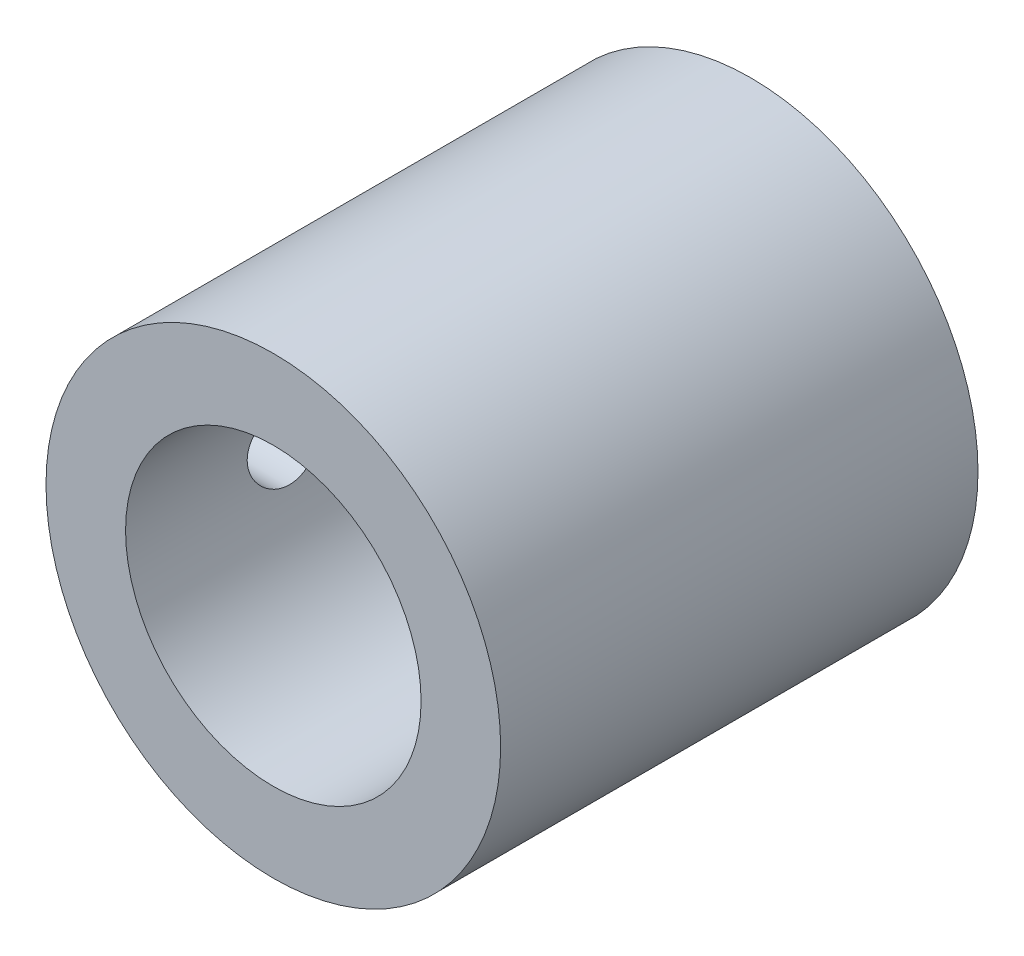
ISO-10303-21;
HEADER;
FILE_DESCRIPTION(('STEP AP214'),'2;1');
FILE_NAME('part.step','',(''),(''),'','','');
FILE_SCHEMA(('AUTOMOTIVE_DESIGN { 1 0 10303 214 1 1 1 1 }'));
ENDSEC;
DATA;
#1=APPLICATION_CONTEXT('core data for automotive mechanical design processes');
#2=APPLICATION_PROTOCOL_DEFINITION('international standard','automotive_design',2000,#1);
#3=PRODUCT_CONTEXT('',#1,'mechanical');
#4=PRODUCT('Part','Part','',(#3));
#5=PRODUCT_RELATED_PRODUCT_CATEGORY('part','',(#4));
#6=PRODUCT_DEFINITION_FORMATION('','',#4);
#7=PRODUCT_DEFINITION_CONTEXT('part definition',#1,'design');
#8=PRODUCT_DEFINITION('design','',#6,#7);
#9=PRODUCT_DEFINITION_SHAPE('','',#8);
#10=(LENGTH_UNIT() NAMED_UNIT(*) SI_UNIT(.MILLI.,.METRE.));
#11=(NAMED_UNIT(*) PLANE_ANGLE_UNIT() SI_UNIT($,.RADIAN.));
#12=(NAMED_UNIT(*) SI_UNIT($,.STERADIAN.) SOLID_ANGLE_UNIT());
#13=UNCERTAINTY_MEASURE_WITH_UNIT(LENGTH_MEASURE(1.E-05),#10,'distance_accuracy_value','');
#14=(GEOMETRIC_REPRESENTATION_CONTEXT(3) GLOBAL_UNCERTAINTY_ASSIGNED_CONTEXT((#13)) GLOBAL_UNIT_ASSIGNED_CONTEXT((#10,
#11,#12)) REPRESENTATION_CONTEXT('',''));
#15=CARTESIAN_POINT('',(0.,0.,0.));
#16=DIRECTION('',(0.,0.,1.));
#17=DIRECTION('',(1.,0.,0.));
#18=AXIS2_PLACEMENT_3D('',#15,#16,#17);
#19=CARTESIAN_POINT('',(0.,0.,0.));
#20=DIRECTION('',(0.,0.,1.));
#21=DIRECTION('',(1.,0.,0.));
#22=AXIS2_PLACEMENT_3D('',#19,#20,#21);
#23=PLANE('',#22);
#24=CARTESIAN_POINT('',(4.24264068711931,4.24264068711926,0.));
#25=DIRECTION('',(0.,0.,-1.));
#26=DIRECTION('',(-1.,0.,0.));
#27=AXIS2_PLACEMENT_3D('',#24,#25,#26);
#28=CIRCLE('',#27,1.24999999999999);
#29=CARTESIAN_POINT('',(2.99264068711932,4.24264068711926,0.));
#30=VERTEX_POINT('',#29);
#31=EDGE_CURVE('E85',#30,#30,#28,.T.);
#32=ORIENTED_EDGE('',*,*,#31,.F.);
#33=EDGE_LOOP('',(#32));
#34=FACE_BOUND('',#33,.T.);
#35=CARTESIAN_POINT('',(0.,0.,0.));
#36=DIRECTION('',(0.,0.,1.));
#37=DIRECTION('',(1.,0.,0.));
#38=AXIS2_PLACEMENT_3D('',#35,#36,#37);
#39=CIRCLE('',#38,10.);
#40=CARTESIAN_POINT('',(10.,0.,0.));
#41=VERTEX_POINT('',#40);
#42=EDGE_CURVE('E104',#41,#41,#39,.T.);
#43=ORIENTED_EDGE('',*,*,#42,.F.);
#44=EDGE_LOOP('',(#43));
#45=FACE_BOUND('',#44,.T.);
#46=CARTESIAN_POINT('',(4.24264068711931,-4.24264068711926,0.));
#47=DIRECTION('',(0.,0.,-1.));
#48=DIRECTION('',(-1.,0.,0.));
#49=AXIS2_PLACEMENT_3D('',#46,#47,#48);
#50=CIRCLE('',#49,1.24999999999999);
#51=CARTESIAN_POINT('',(2.99264068711932,-4.24264068711926,0.));
#52=VERTEX_POINT('',#51);
#53=EDGE_CURVE('E182',#52,#52,#50,.T.);
#54=ORIENTED_EDGE('',*,*,#53,.F.);
#55=EDGE_LOOP('',(#54));
#56=FACE_BOUND('',#55,.T.);
#57=CARTESIAN_POINT('',(-4.24264068711931,-4.24264068711926,0.));
#58=DIRECTION('',(0.,0.,-1.));
#59=DIRECTION('',(-1.,0.,0.));
#60=AXIS2_PLACEMENT_3D('',#57,#58,#59);
#61=CIRCLE('',#60,1.24999999999999);
#62=CARTESIAN_POINT('',(-5.4926406871193,-4.24264068711926,0.));
#63=VERTEX_POINT('',#62);
#64=EDGE_CURVE('E130',#63,#63,#61,.T.);
#65=ORIENTED_EDGE('',*,*,#64,.F.);
#66=EDGE_LOOP('',(#65));
#67=FACE_BOUND('',#66,.T.);
#68=CARTESIAN_POINT('',(-4.24264068711928,4.24264068711929,0.));
#69=DIRECTION('',(0.,0.,-1.));
#70=DIRECTION('',(-1.,0.,0.));
#71=AXIS2_PLACEMENT_3D('',#68,#69,#70);
#72=CIRCLE('',#71,1.24999999999999);
#73=CARTESIAN_POINT('',(-5.49264068711926,4.24264068711929,0.));
#74=VERTEX_POINT('',#73);
#75=EDGE_CURVE('E122',#74,#74,#72,.T.);
#76=ORIENTED_EDGE('',*,*,#75,.F.);
#77=EDGE_LOOP('',(#76));
#78=FACE_BOUND('',#77,.T.);
#79=ADVANCED_FACE('F37',(#34,#45,#56,#67,#78),#23,.F.);
#80=CARTESIAN_POINT('',(0.,0.,21.));
#81=DIRECTION('',(0.,0.,-1.));
#82=DIRECTION('',(-1.,0.,0.));
#83=AXIS2_PLACEMENT_3D('',#80,#81,#82);
#84=CYLINDRICAL_SURFACE('',#83,10.);
#85=CARTESIAN_POINT('',(-10.,0.,15.65));
#86=CARTESIAN_POINT('',(-9.99999843258099,-0.0920114531057511,15.6499962990147));
#87=CARTESIAN_POINT('',(-9.99871684765511,-0.184073454347172,15.6422775413146));
#88=CARTESIAN_POINT('',(-9.99372775496381,-0.365616322535329,15.6116187648621));
#89=CARTESIAN_POINT('',(-9.99001800272159,-0.455094721351768,15.5886646630412));
#90=CARTESIAN_POINT('',(-9.98058875631552,-0.628817487751614,15.5282463610641));
#91=CARTESIAN_POINT('',(-9.974870893487,-0.713066038744484,15.4907939364397));
#92=CARTESIAN_POINT('',(-9.96205444853338,-0.87407223650404,15.4024727458514));
#93=CARTESIAN_POINT('',(-9.95495602786423,-0.950830757653326,15.351605548495));
#94=CARTESIAN_POINT('',(-9.9400912001718,-1.09540879372213,15.2373912228671));
#95=CARTESIAN_POINT('',(-9.93231968689365,-1.16314787882339,15.1739429363817));
#96=CARTESIAN_POINT('',(-9.9170237472334,-1.28706950777735,15.0365852264068));
#97=CARTESIAN_POINT('',(-9.90949933632427,-1.34325132909588,14.9626751493568));
#98=CARTESIAN_POINT('',(-9.89550007731641,-1.44278500045253,14.8059406563233));
#99=CARTESIAN_POINT('',(-9.88903182722124,-1.48605749570898,14.7230652056561));
#100=CARTESIAN_POINT('',(-9.87794796970923,-1.55803674048924,14.5510973747635));
#101=CARTESIAN_POINT('',(-9.8733322397089,-1.58674445381556,14.4620054063507));
#102=CARTESIAN_POINT('',(-9.86652679242373,-1.6285261950301,14.280985417999));
#103=CARTESIAN_POINT('',(-9.86431555933323,-1.64173895927951,14.1890902443212));
#104=CARTESIAN_POINT('',(-9.86250435770823,-1.65258585530687,14.0043626340766));
#105=CARTESIAN_POINT('',(-9.86290420804218,-1.65022106770359,13.9115302629694));
#106=CARTESIAN_POINT('',(-9.86625034802632,-1.63009303176277,13.7285527229433));
#107=CARTESIAN_POINT('',(-9.86917088684506,-1.61248549472487,13.6383898859726));
#108=CARTESIAN_POINT('',(-9.87718903199043,-1.56261607367809,13.4623159294666));
#109=CARTESIAN_POINT('',(-9.88228671162733,-1.53035369619838,13.3764049532117));
#110=CARTESIAN_POINT('',(-9.89411264039674,-1.45193210975571,13.2108064700756));
#111=CARTESIAN_POINT('',(-9.90084846298694,-1.4057081060585,13.1311502107593));
#112=CARTESIAN_POINT('',(-9.9151864393107,-1.30072141548377,12.9806656760922));
#113=CARTESIAN_POINT('',(-9.92278866158316,-1.24195773629986,12.9098381000877));
#114=CARTESIAN_POINT('',(-9.93811607123993,-1.11271072676603,12.7781200211173));
#115=CARTESIAN_POINT('',(-9.94584163094155,-1.04209376928223,12.71736060537));
#116=CARTESIAN_POINT('',(-9.96045987838133,-0.891597059898564,12.6085339783937));
#117=CARTESIAN_POINT('',(-9.9673525609492,-0.811717250503355,12.5604668459529));
#118=CARTESIAN_POINT('',(-9.97953794169528,-0.644840083170751,12.4783778494657));
#119=CARTESIAN_POINT('',(-9.98482933722619,-0.557837003156558,12.444367412362));
#120=CARTESIAN_POINT('',(-9.99320544362233,-0.37924693000247,12.3914780872247));
#121=CARTESIAN_POINT('',(-9.99629033536768,-0.287660313260821,12.3725979588552));
#122=CARTESIAN_POINT('',(-9.99988156603306,-0.103632983819162,12.3506825388388));
#123=CARTESIAN_POINT('',(-10.0004171933872,-0.0112142564118363,12.3474672638785));
#124=CARTESIAN_POINT('',(-9.99892971175882,0.17284150555468,12.3564931986803));
#125=CARTESIAN_POINT('',(-9.99690669920295,0.264478569441162,12.3687338259605));
#126=CARTESIAN_POINT('',(-9.99054737820398,0.443814955541767,12.4081744027771));
#127=CARTESIAN_POINT('',(-9.98622483070291,0.531534371938299,12.4352853943084));
#128=CARTESIAN_POINT('',(-9.97574921956607,0.70118295929459,12.5036023925551));
#129=CARTESIAN_POINT('',(-9.96959605484327,0.783111810188987,12.5448091776617));
#130=CARTESIAN_POINT('',(-9.95606928426946,0.939636398877248,12.640561319499));
#131=CARTESIAN_POINT('',(-9.94868555427359,1.01416235726447,12.6952192859171));
#132=CARTESIAN_POINT('',(-9.93354765732487,1.15304841333208,12.8161671490688));
#133=CARTESIAN_POINT('',(-9.92579346406183,1.21740778758216,12.8824578728543));
#134=CARTESIAN_POINT('',(-9.91069407401676,1.33479962911472,13.0255961063283));
#135=CARTESIAN_POINT('',(-9.90335382329476,1.38771058951943,13.1025438710988));
#136=CARTESIAN_POINT('',(-9.89000528724129,1.47985547415616,13.2643410470675));
#137=CARTESIAN_POINT('',(-9.88399696030451,1.51908982562647,13.3491902113319));
#138=CARTESIAN_POINT('',(-9.87402953570153,1.58258535747086,13.5240395324031));
#139=CARTESIAN_POINT('',(-9.87006212213643,1.60690737863648,13.6140170997967));
#140=CARTESIAN_POINT('',(-9.86460473721113,1.64007952798875,13.7968513117806));
#141=CARTESIAN_POINT('',(-9.86311455516768,1.64893097191818,13.8897077108482));
#142=CARTESIAN_POINT('',(-9.86278931217107,1.65087457438795,14.0744506413018));
#143=CARTESIAN_POINT('',(-9.86392203182987,1.64415796786953,14.1663351601921));
#144=CARTESIAN_POINT('',(-9.86864441177183,1.61556925478546,14.3476477518639));
#145=CARTESIAN_POINT('',(-9.87223406454433,1.59369719454886,14.4370758321536));
#146=CARTESIAN_POINT('',(-9.88145370519205,1.53549112071356,14.6108652424354));
#147=CARTESIAN_POINT('',(-9.88708141498759,1.49917324977365,14.695232107451));
#148=CARTESIAN_POINT('',(-9.89974533231771,1.41312606218934,14.8567062668603));
#149=CARTESIAN_POINT('',(-9.90678160742252,1.36339610211421,14.9338132127277));
#150=CARTESIAN_POINT('',(-9.92157214136343,1.25125259966706,15.0795454976377));
#151=CARTESIAN_POINT('',(-9.92933379899765,1.18869826623126,15.1480617598196));
#152=CARTESIAN_POINT('',(-9.94464125601211,1.05297867490409,15.2736905998767));
#153=CARTESIAN_POINT('',(-9.95218700513286,0.97981097009267,15.3308005407802));
#154=CARTESIAN_POINT('',(-9.96627143049842,0.824354696103045,15.4323474225735));
#155=CARTESIAN_POINT('',(-9.97280295936929,0.742007852048186,15.476696147978));
#156=CARTESIAN_POINT('',(-9.98405342047581,0.570959586923795,15.5508633528063));
#157=CARTESIAN_POINT('',(-9.98877416450827,0.482264623543764,15.5806963641252));
#158=CARTESIAN_POINT('',(-9.99483601455804,0.327682758240929,15.6184793415268));
#159=CARTESIAN_POINT('',(-9.99676220083327,0.2627330667111,15.6302807488145));
#160=CARTESIAN_POINT('',(-9.99934474465587,0.13186422762594,15.6460423389331));
#161=CARTESIAN_POINT('',(-10.0000011233775,0.0659450962546687,15.6500026525158));
#162=CARTESIAN_POINT('',(-10.,0.,15.65));
#163=B_SPLINE_CURVE_WITH_KNOTS('',3,(#85,#86,#87,#88,#89,#90,#91,#92,#93,#94,#95,#96,#97,#98,
#99,#100,#101,#102,#103,#104,#105,#106,#107,#108,#109,#110,#111,#112,#113,#114,#115,#116,#117,
#118,#119,#120,#121,#122,#123,#124,#125,#126,#127,#128,#129,#130,#131,#132,#133,#134,#135,#136,
#137,#138,#139,#140,#141,#142,#143,#144,#145,#146,#147,#148,#149,#150,#151,#152,#153,#154,#155,
#156,#157,#158,#159,#160,#161,#162),.UNSPECIFIED.,.T.,.F.,(4,2,2,2,2,2,2,2,2,2,2,2,2,2,2,2,2,2,
2,2,2,2,2,2,2,2,2,2,2,2,2,2,2,2,2,2,2,2,4),(0.,0.275793319008918,0.551841928312973,
0.827666799870598,1.1034594331417,1.38156673144316,1.65969141110741,1.93949209608633,
2.21927426326044,2.49653175525206,2.77377001402269,3.04820914252876,3.32265751287872,
3.59839967320042,3.87416366201707,4.1532757240192,4.43238951858747,4.71172976565332,
4.99104711092801,5.26714751096617,5.54323750600189,5.81769359979004,6.09216485190803,
6.36901711215386,6.64588906369257,6.92556925596459,7.20524071063228,7.48376340648033,
7.76226241335696,8.03735855216244,8.31245385002402,8.58724259883659,8.86204453269316,
9.14004258759617,9.41810483731131,9.69804546871318,9.97770526783281,10.1753710978727,
10.3730336317698),.UNSPECIFIED.);
#164=CARTESIAN_POINT('',(-10.,0.,15.65));
#165=VERTEX_POINT('',#164);
#166=EDGE_CURVE('E134',#165,#165,#163,.T.);
#167=ORIENTED_EDGE('',*,*,#166,.T.);
#168=EDGE_LOOP('',(#167));
#169=FACE_BOUND('',#168,.T.);
#170=CARTESIAN_POINT('',(0.,0.,21.));
#171=DIRECTION('',(0.,0.,1.));
#172=DIRECTION('',(1.,0.,0.));
#173=AXIS2_PLACEMENT_3D('',#170,#171,#172);
#174=CIRCLE('',#173,10.);
#175=CARTESIAN_POINT('',(10.,0.,21.));
#176=VERTEX_POINT('',#175);
#177=EDGE_CURVE('E142',#176,#176,#174,.T.);
#178=ORIENTED_EDGE('',*,*,#177,.F.);
#179=EDGE_LOOP('',(#178));
#180=FACE_BOUND('',#179,.T.);
#181=ORIENTED_EDGE('',*,*,#42,.T.);
#182=EDGE_LOOP('',(#181));
#183=FACE_BOUND('',#182,.T.);
#184=ADVANCED_FACE('F39',(#169,#180,#183),#84,.T.);
#185=CARTESIAN_POINT('',(0.,0.,21.));
#186=DIRECTION('',(0.,0.,1.));
#187=DIRECTION('',(1.,0.,0.));
#188=AXIS2_PLACEMENT_3D('',#185,#186,#187);
#189=PLANE('',#188);
#190=CARTESIAN_POINT('',(0.,0.,21.));
#191=DIRECTION('',(0.,0.,1.));
#192=DIRECTION('',(1.,0.,0.));
#193=AXIS2_PLACEMENT_3D('',#190,#191,#192);
#194=CIRCLE('',#193,6.5);
#195=CARTESIAN_POINT('',(6.5,0.,21.));
#196=VERTEX_POINT('',#195);
#197=EDGE_CURVE('E114',#196,#196,#194,.T.);
#198=ORIENTED_EDGE('',*,*,#197,.F.);
#199=EDGE_LOOP('',(#198));
#200=FACE_BOUND('',#199,.T.);
#201=ORIENTED_EDGE('',*,*,#177,.T.);
#202=EDGE_LOOP('',(#201));
#203=FACE_BOUND('',#202,.T.);
#204=ADVANCED_FACE('F163',(#200,#203),#189,.T.);
#205=CARTESIAN_POINT('',(0.,0.,6.));
#206=DIRECTION('',(0.,0.,1.));
#207=DIRECTION('',(1.,0.,0.));
#208=AXIS2_PLACEMENT_3D('',#205,#206,#207);
#209=CYLINDRICAL_SURFACE('',#208,6.5);
#210=CARTESIAN_POINT('',(-6.5,0.,15.65));
#211=CARTESIAN_POINT('',(-6.49999849148033,0.0911177503858731,15.6499975271443));
#212=CARTESIAN_POINT('',(-6.4980650151015,0.182262858095387,15.6424269510268));
#213=CARTESIAN_POINT('',(-6.49053943796148,0.361937820756668,15.6123918810941));
#214=CARTESIAN_POINT('',(-6.48494533438108,0.450466216312033,15.5899192338991));
#215=CARTESIAN_POINT('',(-6.47071750795578,0.622287397419872,15.5308498534362));
#216=CARTESIAN_POINT('',(-6.46208749750639,0.705586431636939,15.4942703651899));
#217=CARTESIAN_POINT('',(-6.44270535969817,0.864866150834567,15.4080870708407));
#218=CARTESIAN_POINT('',(-6.43195314475064,0.940846533563351,15.3584827271415));
#219=CARTESIAN_POINT('',(-6.40923777941342,1.08494165624619,15.2465480115112));
#220=CARTESIAN_POINT('',(-6.39725548483154,1.15287927915146,15.1839935093819));
#221=CARTESIAN_POINT('',(-6.37355665387331,1.2774205628457,15.0484138634561));
#222=CARTESIAN_POINT('',(-6.36184014855969,1.33402290487283,14.9753875030435));
#223=CARTESIAN_POINT('',(-6.33980584668286,1.43512676812558,14.8195531706555));
#224=CARTESIAN_POINT('',(-6.32951232072087,1.47942889215842,14.7366120872206));
#225=CARTESIAN_POINT('',(-6.31176915976443,1.55339199639589,14.5641559394432));
#226=CARTESIAN_POINT('',(-6.3043190546097,1.58305539735461,14.4746419648511));
#227=CARTESIAN_POINT('',(-6.29330322679464,1.62629233475194,14.2935317839025));
#228=CARTESIAN_POINT('',(-6.28966059809192,1.64018493928543,14.2020165371914));
#229=CARTESIAN_POINT('',(-6.28644204901193,1.65247997744377,14.0178874125951));
#230=CARTESIAN_POINT('',(-6.28686544513413,1.65088501453495,13.9252737219731));
#231=CARTESIAN_POINT('',(-6.29166204403964,1.63250447801232,13.74403211902));
#232=CARTESIAN_POINT('',(-6.29593604050051,1.61610042228528,13.6553624779331));
#233=CARTESIAN_POINT('',(-6.30779399869364,1.56917650684075,13.482076866203));
#234=CARTESIAN_POINT('',(-6.31537820273062,1.53865561377152,13.3974611928105));
#235=CARTESIAN_POINT('',(-6.33309221869858,1.46404250493563,13.233668872872));
#236=CARTESIAN_POINT('',(-6.34324760249032,1.41981289361812,13.154557696682));
#237=CARTESIAN_POINT('',(-6.364945442261,1.31913389984381,13.0047439402813));
#238=CARTESIAN_POINT('',(-6.37648814769664,1.26268231826682,12.9340428768687));
#239=CARTESIAN_POINT('',(-6.40007669661782,1.13719136135146,12.8008714139835));
#240=CARTESIAN_POINT('',(-6.41212734929307,1.06783038255625,12.7387045308094));
#241=CARTESIAN_POINT('',(-6.43506800190513,0.919522532515227,12.6268261884887));
#242=CARTESIAN_POINT('',(-6.4459579641844,0.840575350431436,12.5771151333895));
#243=CARTESIAN_POINT('',(-6.4654072019095,0.674894732770334,12.4914431523107));
#244=CARTESIAN_POINT('',(-6.47395787369381,0.588134074053322,12.4555327930044));
#245=CARTESIAN_POINT('',(-6.48770263023884,0.409541718403763,12.3988920585116));
#246=CARTESIAN_POINT('',(-6.49289737755419,0.317711026327971,12.3781586868498));
#247=CARTESIAN_POINT('',(-6.49924644511166,0.134179279177315,12.3529269360867));
#248=CARTESIAN_POINT('',(-6.5005035683198,0.0425384989604831,12.3480153835219));
#249=CARTESIAN_POINT('',(-6.4991291685556,-0.140255983188986,12.3534317074649));
#250=CARTESIAN_POINT('',(-6.49649800722503,-0.231409729628337,12.3637581667149));
#251=CARTESIAN_POINT('',(-6.48770867929811,-0.409198092309223,12.3990171731005));
#252=CARTESIAN_POINT('',(-6.48160524971031,-0.495880588598904,12.4237231766394));
#253=CARTESIAN_POINT('',(-6.46656022798463,-0.663865402904556,12.4867802242886));
#254=CARTESIAN_POINT('',(-6.45761834418719,-0.745167166996457,12.5251326706602));
#255=CARTESIAN_POINT('',(-6.4376432610754,-0.901717887469289,12.6151868784053));
#256=CARTESIAN_POINT('',(-6.42657501104735,-0.976830003962308,12.6671185596132));
#257=CARTESIAN_POINT('',(-6.40362831883756,-1.11741986610505,12.7825643066315));
#258=CARTESIAN_POINT('',(-6.39174973250325,-1.18289589099313,12.8460804366069));
#259=CARTESIAN_POINT('',(-6.36814923136526,-1.30406635448273,12.9848128318325));
#260=CARTESIAN_POINT('',(-6.35643893296219,-1.35947055793743,13.0602850051769));
#261=CARTESIAN_POINT('',(-6.33483594517711,-1.45682878188372,13.2196981261065));
#262=CARTESIAN_POINT('',(-6.32494317580465,-1.49878339435969,13.3036387007409));
#263=CARTESIAN_POINT('',(-6.30820564851897,-1.56773755394613,13.4771608999336));
#264=CARTESIAN_POINT('',(-6.30134291296739,-1.59482554658986,13.566705552564));
#265=CARTESIAN_POINT('',(-6.29142787777632,-1.63350588726022,13.7492797142624));
#266=CARTESIAN_POINT('',(-6.28837471379837,-1.64510175027641,13.8423084279103));
#267=CARTESIAN_POINT('',(-6.28649183842141,-1.65228074681225,14.0262525782131));
#268=CARTESIAN_POINT('',(-6.28753962152452,-1.64832832798558,14.1171489199998));
#269=CARTESIAN_POINT('',(-6.29345653429825,-1.62558916594653,14.2969334908211));
#270=CARTESIAN_POINT('',(-6.29832558250899,-1.60680273895831,14.3858217626213));
#271=CARTESIAN_POINT('',(-6.31126706173436,-1.55518610871843,14.5585440684628));
#272=CARTESIAN_POINT('',(-6.31931901702728,-1.522445569368,14.6424065380379));
#273=CARTESIAN_POINT('',(-6.3377213707967,-1.44392066335697,14.8035088724099));
#274=CARTESIAN_POINT('',(-6.34807209772023,-1.3981344324715,14.8807477886496));
#275=CARTESIAN_POINT('',(-6.37025290066772,-1.29337273284388,15.0286486942442));
#276=CARTESIAN_POINT('',(-6.38211523105464,-1.23407618889245,15.0990784573145));
#277=CARTESIAN_POINT('',(-6.40579298687251,-1.10459937775599,15.2291390142026));
#278=CARTESIAN_POINT('',(-6.41760840043669,-1.03441651710483,15.2887672273912));
#279=CARTESIAN_POINT('',(-6.44012670826218,-0.883564094524522,15.3966290836568));
#280=CARTESIAN_POINT('',(-6.45080446058256,-0.802721933411485,15.4446269911767));
#281=CARTESIAN_POINT('',(-6.46957701766543,-0.633851244249661,15.526274811358));
#282=CARTESIAN_POINT('',(-6.47767362922087,-0.545827797531961,15.5599347661284));
#283=CARTESIAN_POINT('',(-6.48920819390174,-0.381665270886311,15.6070903673807));
#284=CARTESIAN_POINT('',(-6.49322694643271,-0.306292143202488,15.62314612518));
#285=CARTESIAN_POINT('',(-6.49862338093772,-0.153952434713927,15.6446015591842));
#286=CARTESIAN_POINT('',(-6.50000127455811,-0.076985982102799,15.650002089332));
#287=CARTESIAN_POINT('',(-6.5,0.,15.65));
#288=B_SPLINE_CURVE_WITH_KNOTS('',3,(#210,#211,#212,#213,#214,#215,#216,#217,#218,#219,#220,
#221,#222,#223,#224,#225,#226,#227,#228,#229,#230,#231,#232,#233,#234,#235,#236,#237,#238,#239,
#240,#241,#242,#243,#244,#245,#246,#247,#248,#249,#250,#251,#252,#253,#254,#255,#256,#257,#258,
#259,#260,#261,#262,#263,#264,#265,#266,#267,#268,#269,#270,#271,#272,#273,#274,#275,#276,#277,
#278,#279,#280,#281,#282,#283,#284,#285,#286,#287),.UNSPECIFIED.,.T.,.F.,(4,2,2,2,2,2,2,2,2,2,2,
2,2,2,2,2,2,2,2,2,2,2,2,2,2,2,2,2,2,2,2,2,2,2,2,2,2,2,4),(0.,0.273071080673042,
0.546291690312233,0.819179352572715,1.09207827994795,1.37016840025652,1.64829085517239,
1.93068877591831,2.21303998185288,2.48957086262239,2.76605525924413,3.03561386213349,
3.30519219982155,3.5775648784331,3.84998660632107,4.13042684673474,4.41087618300893,
4.69234352388222,4.97375527812577,5.24775597584741,5.52173119090107,5.7915025937798,
6.06130172544543,6.33600366696577,6.61075460391992,6.89247457814753,7.17418215075422,
7.45419508187937,7.73414447043176,8.00579583650453,8.27744141180216,8.54736720344426,
8.81733158675164,9.09454331866244,9.37182119292242,9.65432089037337,9.93662240220948,
10.167360433645,10.398079972269),.UNSPECIFIED.);
#289=CARTESIAN_POINT('',(-6.5,0.,15.65));
#290=VERTEX_POINT('',#289);
#291=EDGE_CURVE('E117',#290,#290,#288,.T.);
#292=ORIENTED_EDGE('',*,*,#291,.T.);
#293=EDGE_LOOP('',(#292));
#294=FACE_BOUND('',#293,.T.);
#295=CARTESIAN_POINT('',(0.,0.,6.));
#296=DIRECTION('',(0.,0.,1.));
#297=DIRECTION('',(1.,0.,0.));
#298=AXIS2_PLACEMENT_3D('',#295,#296,#297);
#299=CIRCLE('',#298,6.5);
#300=CARTESIAN_POINT('',(3.67923766179357,-5.358470885247,6.));
#301=VERTEX_POINT('',#300);
#302=CARTESIAN_POINT('',(5.35847088524704,-3.67923766179351,6.));
#303=VERTEX_POINT('',#302);
#304=EDGE_CURVE('E101',#301,#303,#299,.T.);
#305=ORIENTED_EDGE('',*,*,#304,.F.);
#306=CARTESIAN_POINT('',(-3.67923766179357,-5.358470885247,6.));
#307=VERTEX_POINT('',#306);
#308=EDGE_CURVE('E108',#307,#301,#299,.T.);
#309=ORIENTED_EDGE('',*,*,#308,.F.);
#310=CARTESIAN_POINT('',(-5.35847088524704,-3.67923766179351,6.));
#311=VERTEX_POINT('',#310);
#312=EDGE_CURVE('E102',#311,#307,#299,.T.);
#313=ORIENTED_EDGE('',*,*,#312,.F.);
#314=CARTESIAN_POINT('',(-5.35847088524701,3.67923766179355,6.));
#315=VERTEX_POINT('',#314);
#316=EDGE_CURVE('E96',#315,#311,#299,.T.);
#317=ORIENTED_EDGE('',*,*,#316,.F.);
#318=CARTESIAN_POINT('',(-3.67923766179353,5.35847088524703,6.));
#319=VERTEX_POINT('',#318);
#320=EDGE_CURVE('E113',#319,#315,#299,.T.);
#321=ORIENTED_EDGE('',*,*,#320,.F.);
#322=CARTESIAN_POINT('',(3.67923766179357,5.358470885247,6.));
#323=VERTEX_POINT('',#322);
#324=EDGE_CURVE('E94',#323,#319,#299,.T.);
#325=ORIENTED_EDGE('',*,*,#324,.F.);
#326=CARTESIAN_POINT('',(5.35847088524704,3.67923766179351,6.));
#327=VERTEX_POINT('',#326);
#328=EDGE_CURVE('E84',#327,#323,#299,.T.);
#329=ORIENTED_EDGE('',*,*,#328,.F.);
#330=EDGE_CURVE('E92',#303,#327,#299,.T.);
#331=ORIENTED_EDGE('',*,*,#330,.F.);
#332=EDGE_LOOP('',(#305,#309,#313,#317,#321,#325,#329,#331));
#333=FACE_BOUND('',#332,.T.);
#334=ORIENTED_EDGE('',*,*,#197,.T.);
#335=EDGE_LOOP('',(#334));
#336=FACE_BOUND('',#335,.T.);
#337=ADVANCED_FACE('F90',(#294,#333,#336),#209,.F.);
#338=CARTESIAN_POINT('',(0.,0.,6.));
#339=DIRECTION('',(0.,0.,1.));
#340=DIRECTION('',(1.,0.,0.));
#341=AXIS2_PLACEMENT_3D('',#338,#339,#340);
#342=PLANE('',#341);
#343=CARTESIAN_POINT('',(4.24264068711931,4.24264068711926,6.));
#344=DIRECTION('',(0.,0.,1.));
#345=DIRECTION('',(1.,0.,0.));
#346=AXIS2_PLACEMENT_3D('',#343,#344,#345);
#347=CIRCLE('',#346,1.24999999999999);
#348=EDGE_CURVE('E11',#323,#327,#347,.T.);
#349=ORIENTED_EDGE('',*,*,#348,.F.);
#350=ORIENTED_EDGE('',*,*,#324,.T.);
#351=CARTESIAN_POINT('',(-4.24264068711928,4.24264068711929,6.));
#352=DIRECTION('',(0.,0.,1.));
#353=DIRECTION('',(1.,0.,0.));
#354=AXIS2_PLACEMENT_3D('',#351,#352,#353);
#355=CIRCLE('',#354,1.24999999999999);
#356=EDGE_CURVE('E46',#315,#319,#355,.T.);
#357=ORIENTED_EDGE('',*,*,#356,.F.);
#358=ORIENTED_EDGE('',*,*,#316,.T.);
#359=CARTESIAN_POINT('',(-4.24264068711931,-4.24264068711926,6.));
#360=DIRECTION('',(0.,0.,1.));
#361=DIRECTION('',(1.,0.,0.));
#362=AXIS2_PLACEMENT_3D('',#359,#360,#361);
#363=CIRCLE('',#362,1.24999999999999);
#364=EDGE_CURVE('E125',#307,#311,#363,.T.);
#365=ORIENTED_EDGE('',*,*,#364,.F.);
#366=ORIENTED_EDGE('',*,*,#308,.T.);
#367=CARTESIAN_POINT('',(4.24264068711931,-4.24264068711926,6.));
#368=DIRECTION('',(0.,0.,1.));
#369=DIRECTION('',(1.,0.,0.));
#370=AXIS2_PLACEMENT_3D('',#367,#368,#369);
#371=CIRCLE('',#370,1.24999999999999);
#372=EDGE_CURVE('E100',#303,#301,#371,.T.);
#373=ORIENTED_EDGE('',*,*,#372,.F.);
#374=ORIENTED_EDGE('',*,*,#330,.T.);
#375=EDGE_LOOP('',(#349,#350,#357,#358,#365,#366,#373,#374));
#376=FACE_BOUND('',#375,.T.);
#377=ADVANCED_FACE('F98',(#376),#342,.T.);
#378=CARTESIAN_POINT('',(-10.,0.,14.));
#379=DIRECTION('',(-1.,0.,0.));
#380=DIRECTION('',(0.,0.,1.));
#381=AXIS2_PLACEMENT_3D('',#378,#379,#380);
#382=CYLINDRICAL_SURFACE('',#381,1.64999999999999);
#383=ORIENTED_EDGE('',*,*,#166,.F.);
#384=EDGE_LOOP('',(#383));
#385=FACE_BOUND('',#384,.T.);
#386=ORIENTED_EDGE('',*,*,#291,.F.);
#387=EDGE_LOOP('',(#386));
#388=FACE_BOUND('',#387,.T.);
#389=ADVANCED_FACE('F144',(#385,#388),#382,.F.);
#390=CARTESIAN_POINT('',(0.,0.,6.));
#391=DIRECTION('',(0.,0.,1.));
#392=DIRECTION('',(1.,0.,0.));
#393=AXIS2_PLACEMENT_3D('',#390,#391,#392);
#394=PLANE('',#393);
#395=ORIENTED_EDGE('',*,*,#304,.T.);
#396=CARTESIAN_POINT('',(4.24264068711931,-4.24264068711926,6.));
#397=DIRECTION('',(0.,0.,1.));
#398=DIRECTION('',(1.,0.,0.));
#399=AXIS2_PLACEMENT_3D('',#396,#397,#398);
#400=CIRCLE('',#399,1.24999999999999);
#401=EDGE_CURVE('E158',#303,#301,#400,.F.);
#402=ORIENTED_EDGE('',*,*,#401,.T.);
#403=EDGE_LOOP('',(#395,#402));
#404=FACE_BOUND('',#403,.T.);
#405=ADVANCED_FACE('F149',(#404),#394,.F.);
#406=CARTESIAN_POINT('',(4.24264068711931,-4.24264068711926,0.));
#407=DIRECTION('',(0.,0.,-1.));
#408=DIRECTION('',(-1.,0.,0.));
#409=AXIS2_PLACEMENT_3D('',#406,#407,#408);
#410=CYLINDRICAL_SURFACE('',#409,1.24999999999999);
#411=ORIENTED_EDGE('',*,*,#53,.T.);
#412=EDGE_LOOP('',(#411));
#413=FACE_BOUND('',#412,.T.);
#414=ORIENTED_EDGE('',*,*,#372,.T.);
#415=ORIENTED_EDGE('',*,*,#401,.F.);
#416=EDGE_LOOP('',(#414,#415));
#417=FACE_BOUND('',#416,.T.);
#418=ADVANCED_FACE('F196',(#413,#417),#410,.F.);
#419=CARTESIAN_POINT('',(-4.24264068711931,-4.24264068711926,0.));
#420=DIRECTION('',(0.,0.,-1.));
#421=DIRECTION('',(-1.,0.,0.));
#422=AXIS2_PLACEMENT_3D('',#419,#420,#421);
#423=CYLINDRICAL_SURFACE('',#422,1.24999999999999);
#424=ORIENTED_EDGE('',*,*,#64,.T.);
#425=EDGE_LOOP('',(#424));
#426=FACE_BOUND('',#425,.T.);
#427=ORIENTED_EDGE('',*,*,#364,.T.);
#428=CARTESIAN_POINT('',(-4.24264068711931,-4.24264068711926,6.));
#429=DIRECTION('',(0.,0.,1.));
#430=DIRECTION('',(1.,0.,0.));
#431=AXIS2_PLACEMENT_3D('',#428,#429,#430);
#432=CIRCLE('',#431,1.24999999999999);
#433=EDGE_CURVE('E127',#307,#311,#432,.F.);
#434=ORIENTED_EDGE('',*,*,#433,.F.);
#435=EDGE_LOOP('',(#427,#434));
#436=FACE_BOUND('',#435,.T.);
#437=ADVANCED_FACE('F132',(#426,#436),#423,.F.);
#438=CARTESIAN_POINT('',(0.,0.,6.));
#439=DIRECTION('',(0.,0.,1.));
#440=DIRECTION('',(1.,0.,0.));
#441=AXIS2_PLACEMENT_3D('',#438,#439,#440);
#442=PLANE('',#441);
#443=ORIENTED_EDGE('',*,*,#312,.T.);
#444=ORIENTED_EDGE('',*,*,#433,.T.);
#445=EDGE_LOOP('',(#443,#444));
#446=FACE_BOUND('',#445,.T.);
#447=ADVANCED_FACE('F128',(#446),#442,.F.);
#448=CARTESIAN_POINT('',(-4.24264068711928,4.24264068711929,0.));
#449=DIRECTION('',(0.,0.,-1.));
#450=DIRECTION('',(-1.,0.,0.));
#451=AXIS2_PLACEMENT_3D('',#448,#449,#450);
#452=CYLINDRICAL_SURFACE('',#451,1.24999999999999);
#453=ORIENTED_EDGE('',*,*,#75,.T.);
#454=EDGE_LOOP('',(#453));
#455=FACE_BOUND('',#454,.T.);
#456=ORIENTED_EDGE('',*,*,#356,.T.);
#457=CARTESIAN_POINT('',(-4.24264068711928,4.24264068711929,6.));
#458=DIRECTION('',(0.,0.,1.));
#459=DIRECTION('',(1.,0.,0.));
#460=AXIS2_PLACEMENT_3D('',#457,#458,#459);
#461=CIRCLE('',#460,1.24999999999999);
#462=EDGE_CURVE('E58',#315,#319,#461,.F.);
#463=ORIENTED_EDGE('',*,*,#462,.F.);
#464=EDGE_LOOP('',(#456,#463));
#465=FACE_BOUND('',#464,.T.);
#466=ADVANCED_FACE('F124',(#455,#465),#452,.F.);
#467=CARTESIAN_POINT('',(0.,0.,6.));
#468=DIRECTION('',(0.,0.,1.));
#469=DIRECTION('',(1.,0.,0.));
#470=AXIS2_PLACEMENT_3D('',#467,#468,#469);
#471=PLANE('',#470);
#472=ORIENTED_EDGE('',*,*,#320,.T.);
#473=ORIENTED_EDGE('',*,*,#462,.T.);
#474=EDGE_LOOP('',(#472,#473));
#475=FACE_BOUND('',#474,.T.);
#476=ADVANCED_FACE('F121',(#475),#471,.F.);
#477=CARTESIAN_POINT('',(0.,0.,6.));
#478=DIRECTION('',(0.,0.,1.));
#479=DIRECTION('',(1.,0.,0.));
#480=AXIS2_PLACEMENT_3D('',#477,#478,#479);
#481=PLANE('',#480);
#482=ORIENTED_EDGE('',*,*,#328,.T.);
#483=CARTESIAN_POINT('',(4.24264068711931,4.24264068711926,6.));
#484=DIRECTION('',(0.,0.,1.));
#485=DIRECTION('',(1.,0.,0.));
#486=AXIS2_PLACEMENT_3D('',#483,#484,#485);
#487=CIRCLE('',#486,1.24999999999999);
#488=EDGE_CURVE('E51',#323,#327,#487,.F.);
#489=ORIENTED_EDGE('',*,*,#488,.T.);
#490=EDGE_LOOP('',(#482,#489));
#491=FACE_BOUND('',#490,.T.);
#492=ADVANCED_FACE('F83',(#491),#481,.F.);
#493=CARTESIAN_POINT('',(4.24264068711931,4.24264068711926,0.));
#494=DIRECTION('',(0.,0.,-1.));
#495=DIRECTION('',(-1.,0.,0.));
#496=AXIS2_PLACEMENT_3D('',#493,#494,#495);
#497=CYLINDRICAL_SURFACE('',#496,1.24999999999999);
#498=ORIENTED_EDGE('',*,*,#31,.T.);
#499=EDGE_LOOP('',(#498));
#500=FACE_BOUND('',#499,.T.);
#501=ORIENTED_EDGE('',*,*,#348,.T.);
#502=ORIENTED_EDGE('',*,*,#488,.F.);
#503=EDGE_LOOP('',(#501,#502));
#504=FACE_BOUND('',#503,.T.);
#505=ADVANCED_FACE('F77',(#500,#504),#497,.F.);
#506=CLOSED_SHELL('',(#79,#184,#204,#337,#377,#389,#405,#418,#437,#447,#466,#476,#492,#505));
#507=MANIFOLD_SOLID_BREP('B2',#506);
#508=ADVANCED_BREP_SHAPE_REPRESENTATION('',(#18,#507),#14);
#509=SHAPE_DEFINITION_REPRESENTATION(#9,#508);
ENDSEC;
END-ISO-10303-21;
